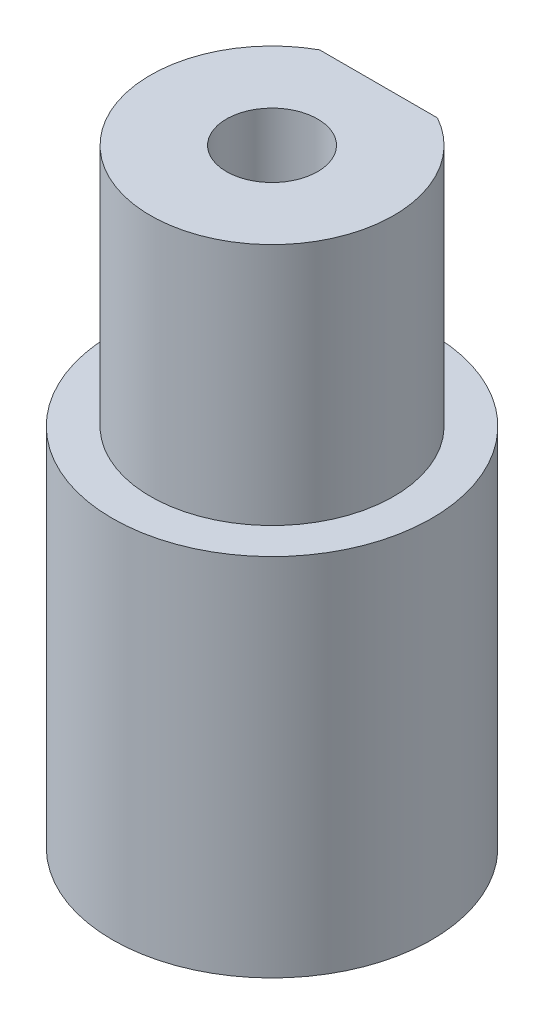
ISO-10303-21;
HEADER;
FILE_DESCRIPTION(('STEP AP214'),'2;1');
FILE_NAME('part.step','',(''),(''),'','','');
FILE_SCHEMA(('AUTOMOTIVE_DESIGN { 1 0 10303 214 1 1 1 1 }'));
ENDSEC;
DATA;
#1=APPLICATION_CONTEXT('core data for automotive mechanical design processes');
#2=APPLICATION_PROTOCOL_DEFINITION('international standard','automotive_design',2000,#1);
#3=PRODUCT_CONTEXT('',#1,'mechanical');
#4=PRODUCT('Part','Part','',(#3));
#5=PRODUCT_RELATED_PRODUCT_CATEGORY('part','',(#4));
#6=PRODUCT_DEFINITION_FORMATION('','',#4);
#7=PRODUCT_DEFINITION_CONTEXT('part definition',#1,'design');
#8=PRODUCT_DEFINITION('design','',#6,#7);
#9=PRODUCT_DEFINITION_SHAPE('','',#8);
#10=(LENGTH_UNIT() NAMED_UNIT(*) SI_UNIT(.MILLI.,.METRE.));
#11=(NAMED_UNIT(*) PLANE_ANGLE_UNIT() SI_UNIT($,.RADIAN.));
#12=(NAMED_UNIT(*) SI_UNIT($,.STERADIAN.) SOLID_ANGLE_UNIT());
#13=UNCERTAINTY_MEASURE_WITH_UNIT(LENGTH_MEASURE(1.E-05),#10,'distance_accuracy_value','');
#14=(GEOMETRIC_REPRESENTATION_CONTEXT(3) GLOBAL_UNCERTAINTY_ASSIGNED_CONTEXT((#13)) GLOBAL_UNIT_ASSIGNED_CONTEXT((#10,
#11,#12)) REPRESENTATION_CONTEXT('',''));
#15=CARTESIAN_POINT('',(0.,0.,0.));
#16=DIRECTION('',(0.,0.,1.));
#17=DIRECTION('',(1.,0.,0.));
#18=AXIS2_PLACEMENT_3D('',#15,#16,#17);
#19=CARTESIAN_POINT('',(0.,12.,0.));
#20=DIRECTION('',(0.,1.,0.));
#21=DIRECTION('',(0.,0.,1.));
#22=AXIS2_PLACEMENT_3D('',#19,#20,#21);
#23=PLANE('',#22);
#24=CARTESIAN_POINT('',(0.,12.,0.));
#25=DIRECTION('',(0.,1.,0.));
#26=DIRECTION('',(0.,0.,1.));
#27=AXIS2_PLACEMENT_3D('',#24,#25,#26);
#28=CIRCLE('',#27,4.);
#29=CARTESIAN_POINT('',(-1.93649167310371,12.,-3.5));
#30=VERTEX_POINT('',#29);
#31=CARTESIAN_POINT('',(1.93649167310371,12.,-3.5));
#32=VERTEX_POINT('',#31);
#33=EDGE_CURVE('E77',#30,#32,#28,.T.);
#34=ORIENTED_EDGE('',*,*,#33,.F.);
#35=DIRECTION('',(1.,0.,0.));
#36=VECTOR('',#35,1.);
#37=CARTESIAN_POINT('',(-1.93649167310371,12.,-3.5));
#38=LINE('',#37,#36);
#39=EDGE_CURVE('E53',#30,#32,#38,.T.);
#40=ORIENTED_EDGE('',*,*,#39,.T.);
#41=EDGE_LOOP('',(#34,#40));
#42=FACE_BOUND('',#41,.T.);
#43=CARTESIAN_POINT('',(0.,12.,0.));
#44=DIRECTION('',(0.,1.,0.));
#45=DIRECTION('',(0.,0.,1.));
#46=AXIS2_PLACEMENT_3D('',#43,#44,#45);
#47=CIRCLE('',#46,5.25);
#48=CARTESIAN_POINT('',(0.,12.,5.25));
#49=VERTEX_POINT('',#48);
#50=EDGE_CURVE('E12',#49,#49,#47,.T.);
#51=ORIENTED_EDGE('',*,*,#50,.T.);
#52=EDGE_LOOP('',(#51));
#53=FACE_BOUND('',#52,.T.);
#54=ADVANCED_FACE('F39',(#42,#53),#23,.T.);
#55=CARTESIAN_POINT('',(0.,0.,0.));
#56=DIRECTION('',(0.,1.,0.));
#57=DIRECTION('',(0.,0.,1.));
#58=AXIS2_PLACEMENT_3D('',#55,#56,#57);
#59=PLANE('',#58);
#60=CARTESIAN_POINT('',(0.,0.,0.));
#61=DIRECTION('',(0.,1.,0.));
#62=DIRECTION('',(0.,0.,1.));
#63=AXIS2_PLACEMENT_3D('',#60,#61,#62);
#64=CIRCLE('',#63,5.25);
#65=CARTESIAN_POINT('',(0.,0.,5.25));
#66=VERTEX_POINT('',#65);
#67=EDGE_CURVE('E43',#66,#66,#64,.T.);
#68=ORIENTED_EDGE('',*,*,#67,.F.);
#69=EDGE_LOOP('',(#68));
#70=FACE_BOUND('',#69,.T.);
#71=CARTESIAN_POINT('',(0.,0.,0.));
#72=DIRECTION('',(0.,1.,0.));
#73=DIRECTION('',(0.,0.,1.));
#74=AXIS2_PLACEMENT_3D('',#71,#72,#73);
#75=CIRCLE('',#74,3.);
#76=CARTESIAN_POINT('',(0.,0.,3.));
#77=VERTEX_POINT('',#76);
#78=EDGE_CURVE('E84',#77,#77,#75,.T.);
#79=ORIENTED_EDGE('',*,*,#78,.T.);
#80=EDGE_LOOP('',(#79));
#81=FACE_BOUND('',#80,.T.);
#82=ADVANCED_FACE('F99',(#70,#81),#59,.F.);
#83=CARTESIAN_POINT('',(0.,12.,0.));
#84=DIRECTION('',(0.,-1.,0.));
#85=DIRECTION('',(0.,0.,-1.));
#86=AXIS2_PLACEMENT_3D('',#83,#84,#85);
#87=CYLINDRICAL_SURFACE('',#86,5.25);
#88=ORIENTED_EDGE('',*,*,#50,.F.);
#89=EDGE_LOOP('',(#88));
#90=FACE_BOUND('',#89,.T.);
#91=ORIENTED_EDGE('',*,*,#67,.T.);
#92=EDGE_LOOP('',(#91));
#93=FACE_BOUND('',#92,.T.);
#94=ADVANCED_FACE('F41',(#90,#93),#87,.T.);
#95=CARTESIAN_POINT('',(0.,12.,0.));
#96=DIRECTION('',(0.,-1.,0.));
#97=DIRECTION('',(0.,0.,-1.));
#98=AXIS2_PLACEMENT_3D('',#95,#96,#97);
#99=CYLINDRICAL_SURFACE('',#98,3.);
#100=CARTESIAN_POINT('',(0.,12.,0.));
#101=DIRECTION('',(0.,1.,0.));
#102=DIRECTION('',(0.,0.,1.));
#103=AXIS2_PLACEMENT_3D('',#100,#101,#102);
#104=CIRCLE('',#103,3.);
#105=CARTESIAN_POINT('',(0.,12.,3.));
#106=VERTEX_POINT('',#105);
#107=EDGE_CURVE('E81',#106,#106,#104,.T.);
#108=ORIENTED_EDGE('',*,*,#107,.T.);
#109=EDGE_LOOP('',(#108));
#110=FACE_BOUND('',#109,.T.);
#111=ORIENTED_EDGE('',*,*,#78,.F.);
#112=EDGE_LOOP('',(#111));
#113=FACE_BOUND('',#112,.T.);
#114=ADVANCED_FACE('F105',(#110,#113),#99,.F.);
#115=CARTESIAN_POINT('',(0.,12.,0.));
#116=DIRECTION('',(0.,1.,0.));
#117=DIRECTION('',(0.,0.,1.));
#118=AXIS2_PLACEMENT_3D('',#115,#116,#117);
#119=PLANE('',#118);
#120=CARTESIAN_POINT('',(0.,12.,0.));
#121=DIRECTION('',(0.,1.,0.));
#122=DIRECTION('',(0.,0.,1.));
#123=AXIS2_PLACEMENT_3D('',#120,#121,#122);
#124=CIRCLE('',#123,1.5);
#125=CARTESIAN_POINT('',(0.,12.,1.5));
#126=VERTEX_POINT('',#125);
#127=EDGE_CURVE('E89',#126,#126,#124,.T.);
#128=ORIENTED_EDGE('',*,*,#127,.T.);
#129=EDGE_LOOP('',(#128));
#130=FACE_BOUND('',#129,.T.);
#131=ORIENTED_EDGE('',*,*,#107,.F.);
#132=EDGE_LOOP('',(#131));
#133=FACE_BOUND('',#132,.T.);
#134=ADVANCED_FACE('F111',(#130,#133),#119,.F.);
#135=CARTESIAN_POINT('',(0.,20.,0.));
#136=DIRECTION('',(0.,1.,0.));
#137=DIRECTION('',(0.,0.,1.));
#138=AXIS2_PLACEMENT_3D('',#135,#136,#137);
#139=PLANE('',#138);
#140=DIRECTION('',(1.,0.,0.));
#141=VECTOR('',#140,1.);
#142=CARTESIAN_POINT('',(-1.93649167310371,20.,-3.5));
#143=LINE('',#142,#141);
#144=CARTESIAN_POINT('',(-1.93649167310371,20.,-3.5));
#145=VERTEX_POINT('',#144);
#146=CARTESIAN_POINT('',(1.93649167310371,20.,-3.5));
#147=VERTEX_POINT('',#146);
#148=EDGE_CURVE('E64',#145,#147,#143,.T.);
#149=ORIENTED_EDGE('',*,*,#148,.F.);
#150=CARTESIAN_POINT('',(0.,20.,0.));
#151=DIRECTION('',(0.,1.,0.));
#152=DIRECTION('',(0.,0.,1.));
#153=AXIS2_PLACEMENT_3D('',#150,#151,#152);
#154=CIRCLE('',#153,4.);
#155=EDGE_CURVE('E76',#145,#147,#154,.T.);
#156=ORIENTED_EDGE('',*,*,#155,.T.);
#157=EDGE_LOOP('',(#149,#156));
#158=FACE_BOUND('',#157,.T.);
#159=CARTESIAN_POINT('',(0.,20.,0.));
#160=DIRECTION('',(0.,1.,0.));
#161=DIRECTION('',(0.,0.,1.));
#162=AXIS2_PLACEMENT_3D('',#159,#160,#161);
#163=CIRCLE('',#162,1.5);
#164=CARTESIAN_POINT('',(0.,20.,1.5));
#165=VERTEX_POINT('',#164);
#166=EDGE_CURVE('E86',#165,#165,#163,.T.);
#167=ORIENTED_EDGE('',*,*,#166,.F.);
#168=EDGE_LOOP('',(#167));
#169=FACE_BOUND('',#168,.T.);
#170=ADVANCED_FACE('F79',(#158,#169),#139,.T.);
#171=CARTESIAN_POINT('',(0.,20.,0.));
#172=DIRECTION('',(0.,-1.,0.));
#173=DIRECTION('',(0.,0.,-1.));
#174=AXIS2_PLACEMENT_3D('',#171,#172,#173);
#175=CYLINDRICAL_SURFACE('',#174,4.);
#176=ORIENTED_EDGE('',*,*,#155,.F.);
#177=DIRECTION('',(0.,1.,0.));
#178=VECTOR('',#177,1.);
#179=CARTESIAN_POINT('',(-1.93649167310371,12.,-3.5));
#180=LINE('',#179,#178);
#181=EDGE_CURVE('E69',#30,#145,#180,.T.);
#182=ORIENTED_EDGE('',*,*,#181,.F.);
#183=ORIENTED_EDGE('',*,*,#33,.T.);
#184=DIRECTION('',(0.,1.,0.));
#185=VECTOR('',#184,1.);
#186=CARTESIAN_POINT('',(1.93649167310371,12.,-3.5));
#187=LINE('',#186,#185);
#188=EDGE_CURVE('E67',#32,#147,#187,.T.);
#189=ORIENTED_EDGE('',*,*,#188,.T.);
#190=EDGE_LOOP('',(#176,#182,#183,#189));
#191=FACE_BOUND('',#190,.T.);
#192=ADVANCED_FACE('F75',(#191),#175,.T.);
#193=CARTESIAN_POINT('',(0.,20.,0.));
#194=DIRECTION('',(0.,-1.,0.));
#195=DIRECTION('',(0.,0.,-1.));
#196=AXIS2_PLACEMENT_3D('',#193,#194,#195);
#197=CYLINDRICAL_SURFACE('',#196,1.5);
#198=ORIENTED_EDGE('',*,*,#166,.T.);
#199=EDGE_LOOP('',(#198));
#200=FACE_BOUND('',#199,.T.);
#201=ORIENTED_EDGE('',*,*,#127,.F.);
#202=EDGE_LOOP('',(#201));
#203=FACE_BOUND('',#202,.T.);
#204=ADVANCED_FACE('F115',(#200,#203),#197,.F.);
#205=CARTESIAN_POINT('',(-1.93649167310371,12.,-3.5));
#206=DIRECTION('',(0.,0.,1.));
#207=DIRECTION('',(1.,0.,0.));
#208=AXIS2_PLACEMENT_3D('',#205,#206,#207);
#209=PLANE('',#208);
#210=ORIENTED_EDGE('',*,*,#148,.T.);
#211=ORIENTED_EDGE('',*,*,#188,.F.);
#212=ORIENTED_EDGE('',*,*,#39,.F.);
#213=ORIENTED_EDGE('',*,*,#181,.T.);
#214=EDGE_LOOP('',(#210,#211,#212,#213));
#215=FACE_BOUND('',#214,.T.);
#216=ADVANCED_FACE('F66',(#215),#209,.F.);
#217=CLOSED_SHELL('',(#54,#82,#94,#114,#134,#170,#192,#204,#216));
#218=MANIFOLD_SOLID_BREP('B2',#217);
#219=ADVANCED_BREP_SHAPE_REPRESENTATION('',(#18,#218),#14);
#220=SHAPE_DEFINITION_REPRESENTATION(#9,#219);
ENDSEC;
END-ISO-10303-21;
